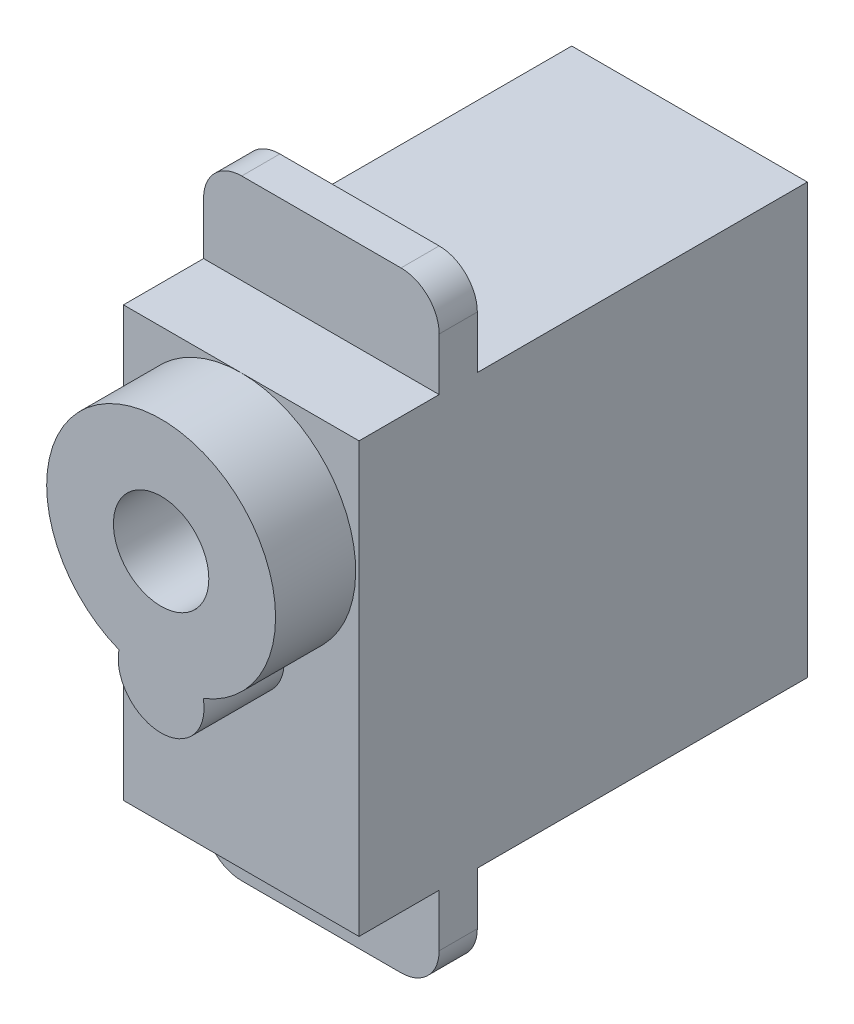
ISO-10303-21;
HEADER;
FILE_DESCRIPTION(('STEP AP214'),'2;1');
FILE_NAME('part.step','',(''),(''),'','','');
FILE_SCHEMA(('AUTOMOTIVE_DESIGN { 1 0 10303 214 1 1 1 1 }'));
ENDSEC;
DATA;
#1=APPLICATION_CONTEXT('core data for automotive mechanical design processes');
#2=APPLICATION_PROTOCOL_DEFINITION('international standard','automotive_design',2000,#1);
#3=PRODUCT_CONTEXT('',#1,'mechanical');
#4=PRODUCT('Part','Part','',(#3));
#5=PRODUCT_RELATED_PRODUCT_CATEGORY('part','',(#4));
#6=PRODUCT_DEFINITION_FORMATION('','',#4);
#7=PRODUCT_DEFINITION_CONTEXT('part definition',#1,'design');
#8=PRODUCT_DEFINITION('design','',#6,#7);
#9=PRODUCT_DEFINITION_SHAPE('','',#8);
#10=(LENGTH_UNIT() NAMED_UNIT(*) SI_UNIT(.MILLI.,.METRE.));
#11=(NAMED_UNIT(*) PLANE_ANGLE_UNIT() SI_UNIT($,.RADIAN.));
#12=(NAMED_UNIT(*) SI_UNIT($,.STERADIAN.) SOLID_ANGLE_UNIT());
#13=UNCERTAINTY_MEASURE_WITH_UNIT(LENGTH_MEASURE(1.E-05),#10,'distance_accuracy_value','');
#14=(GEOMETRIC_REPRESENTATION_CONTEXT(3) GLOBAL_UNCERTAINTY_ASSIGNED_CONTEXT((#13)) GLOBAL_UNIT_ASSIGNED_CONTEXT((#10,
#11,#12)) REPRESENTATION_CONTEXT('',''));
#15=CARTESIAN_POINT('',(0.,0.,0.));
#16=DIRECTION('',(0.,0.,1.));
#17=DIRECTION('',(1.,0.,0.));
#18=AXIS2_PLACEMENT_3D('',#15,#16,#17);
#19=CARTESIAN_POINT('',(6.175,7.58418091123829,178.866706922271));
#20=DIRECTION('',(0.,-1.,0.));
#21=DIRECTION('',(0.,0.,-1.));
#22=AXIS2_PLACEMENT_3D('',#19,#20,#21);
#23=PLANE('',#22);
#24=DIRECTION('',(-1.,0.,0.));
#25=VECTOR('',#24,1.);
#26=CARTESIAN_POINT('',(6.175,7.58418091123829,172.666706922271));
#27=LINE('',#26,#25);
#28=CARTESIAN_POINT('',(6.175,7.5841809112383,172.666706922271));
#29=VERTEX_POINT('',#28);
#30=CARTESIAN_POINT('',(-6.175,7.5841809112383,172.666706922271));
#31=VERTEX_POINT('',#30);
#32=EDGE_CURVE('E228',#29,#31,#27,.T.);
#33=ORIENTED_EDGE('',*,*,#32,.F.);
#34=DIRECTION('',(0.,0.,1.));
#35=VECTOR('',#34,1.);
#36=CARTESIAN_POINT('',(6.175,7.58418091123829,178.866706922271));
#37=LINE('',#36,#35);
#38=CARTESIAN_POINT('',(6.175,7.5841809112383,155.366706922271));
#39=VERTEX_POINT('',#38);
#40=EDGE_CURVE('E232',#39,#29,#37,.T.);
#41=ORIENTED_EDGE('',*,*,#40,.F.);
#42=DIRECTION('',(-1.,0.,0.));
#43=VECTOR('',#42,1.);
#44=CARTESIAN_POINT('',(6.175,7.5841809112383,155.366706922271));
#45=LINE('',#44,#43);
#46=CARTESIAN_POINT('',(-6.175,7.5841809112383,155.366706922271));
#47=VERTEX_POINT('',#46);
#48=EDGE_CURVE('E245',#39,#47,#45,.T.);
#49=ORIENTED_EDGE('',*,*,#48,.T.);
#50=DIRECTION('',(0.,0.,1.));
#51=VECTOR('',#50,1.);
#52=CARTESIAN_POINT('',(-6.175,7.58418091123829,178.866706922271));
#53=LINE('',#52,#51);
#54=EDGE_CURVE('E246',#47,#31,#53,.T.);
#55=ORIENTED_EDGE('',*,*,#54,.T.);
#56=EDGE_LOOP('',(#33,#41,#49,#55));
#57=FACE_BOUND('',#56,.T.);
#58=ADVANCED_FACE('F38',(#57),#23,.F.);
#59=CARTESIAN_POINT('',(6.175,-14.9158190887617,178.866706922271));
#60=DIRECTION('',(0.,1.,0.));
#61=DIRECTION('',(0.,0.,1.));
#62=AXIS2_PLACEMENT_3D('',#59,#60,#61);
#63=PLANE('',#62);
#64=DIRECTION('',(1.,0.,0.));
#65=VECTOR('',#64,1.);
#66=CARTESIAN_POINT('',(6.175,-14.9158190887617,172.666706922271));
#67=LINE('',#66,#65);
#68=CARTESIAN_POINT('',(-6.175,-14.9158190887617,172.666706922271));
#69=VERTEX_POINT('',#68);
#70=CARTESIAN_POINT('',(6.175,-14.9158190887617,172.666706922271));
#71=VERTEX_POINT('',#70);
#72=EDGE_CURVE('E225',#69,#71,#67,.T.);
#73=ORIENTED_EDGE('',*,*,#72,.F.);
#74=DIRECTION('',(0.,0.,-1.));
#75=VECTOR('',#74,1.);
#76=CARTESIAN_POINT('',(-6.175,-14.9158190887617,178.866706922271));
#77=LINE('',#76,#75);
#78=CARTESIAN_POINT('',(-6.175,-14.9158190887617,155.366706922271));
#79=VERTEX_POINT('',#78);
#80=EDGE_CURVE('E251',#69,#79,#77,.T.);
#81=ORIENTED_EDGE('',*,*,#80,.T.);
#82=DIRECTION('',(-1.,0.,0.));
#83=VECTOR('',#82,1.);
#84=CARTESIAN_POINT('',(6.175,-14.9158190887617,155.366706922271));
#85=LINE('',#84,#83);
#86=CARTESIAN_POINT('',(6.175,-14.9158190887617,155.366706922271));
#87=VERTEX_POINT('',#86);
#88=EDGE_CURVE('E260',#87,#79,#85,.T.);
#89=ORIENTED_EDGE('',*,*,#88,.F.);
#90=DIRECTION('',(0.,0.,-1.));
#91=VECTOR('',#90,1.);
#92=CARTESIAN_POINT('',(6.175,-14.9158190887617,178.866706922271));
#93=LINE('',#92,#91);
#94=EDGE_CURVE('E239',#71,#87,#93,.T.);
#95=ORIENTED_EDGE('',*,*,#94,.F.);
#96=EDGE_LOOP('',(#73,#81,#89,#95));
#97=FACE_BOUND('',#96,.T.);
#98=ADVANCED_FACE('F315',(#97),#63,.F.);
#99=CARTESIAN_POINT('',(6.175,7.5841809112383,174.666706922271));
#100=VERTEX_POINT('',#99);
#101=CARTESIAN_POINT('',(6.175,7.58418091123829,178.866706922271));
#102=VERTEX_POINT('',#101);
#103=EDGE_CURVE('E236',#100,#102,#37,.T.);
#104=ORIENTED_EDGE('',*,*,#103,.F.);
#105=DIRECTION('',(-1.,0.,0.));
#106=VECTOR('',#105,1.);
#107=CARTESIAN_POINT('',(6.175,7.58418091123829,174.666706922271));
#108=LINE('',#107,#106);
#109=CARTESIAN_POINT('',(-6.175,7.58418091123829,174.666706922271));
#110=VERTEX_POINT('',#109);
#111=EDGE_CURVE('E222',#100,#110,#108,.T.);
#112=ORIENTED_EDGE('',*,*,#111,.T.);
#113=CARTESIAN_POINT('',(-6.175,7.58418091123829,178.866706922271));
#114=VERTEX_POINT('',#113);
#115=EDGE_CURVE('E231',#110,#114,#53,.T.);
#116=ORIENTED_EDGE('',*,*,#115,.T.);
#117=DIRECTION('',(-1.,0.,0.));
#118=VECTOR('',#117,1.);
#119=CARTESIAN_POINT('',(6.175,7.58418091123829,178.866706922271));
#120=LINE('',#119,#118);
#121=CARTESIAN_POINT('',(0.,7.58418091123829,178.866706922271));
#122=VERTEX_POINT('',#121);
#123=EDGE_CURVE('E267',#122,#114,#120,.T.);
#124=ORIENTED_EDGE('',*,*,#123,.F.);
#125=EDGE_CURVE('E268',#102,#122,#120,.T.);
#126=ORIENTED_EDGE('',*,*,#125,.F.);
#127=EDGE_LOOP('',(#104,#112,#116,#124,#126));
#128=FACE_BOUND('',#127,.T.);
#129=ADVANCED_FACE('F332',(#128),#23,.F.);
#130=CARTESIAN_POINT('',(6.175,7.58418091123829,178.866706922271));
#131=DIRECTION('',(0.,0.,-1.));
#132=DIRECTION('',(-1.,0.,0.));
#133=AXIS2_PLACEMENT_3D('',#130,#131,#132);
#134=PLANE('',#133);
#135=CARTESIAN_POINT('',(0.,-4.41581908876171,178.866706922271));
#136=DIRECTION('',(0.,0.,1.));
#137=DIRECTION('',(1.,0.,0.));
#138=AXIS2_PLACEMENT_3D('',#135,#136,#137);
#139=CIRCLE('',#138,2.25);
#140=CARTESIAN_POINT('',(-2.21009535639868,-3.99394408876171,178.866706922271));
#141=VERTEX_POINT('',#140);
#142=CARTESIAN_POINT('',(2.21009535639868,-3.99394408876171,178.866706922271));
#143=VERTEX_POINT('',#142);
#144=EDGE_CURVE('E187',#141,#143,#139,.T.);
#145=ORIENTED_EDGE('',*,*,#144,.F.);
#146=CARTESIAN_POINT('',(0.,1.58418091123829,178.866706922271));
#147=DIRECTION('',(0.,0.,1.));
#148=DIRECTION('',(1.,0.,0.));
#149=AXIS2_PLACEMENT_3D('',#146,#147,#148);
#150=CIRCLE('',#149,6.);
#151=EDGE_CURVE('E271',#122,#141,#150,.T.);
#152=ORIENTED_EDGE('',*,*,#151,.F.);
#153=ORIENTED_EDGE('',*,*,#123,.T.);
#154=DIRECTION('',(0.,-1.,0.));
#155=VECTOR('',#154,1.);
#156=CARTESIAN_POINT('',(-6.175,7.58418091123829,178.866706922271));
#157=LINE('',#156,#155);
#158=CARTESIAN_POINT('',(-6.175,-14.9158190887617,178.866706922271));
#159=VERTEX_POINT('',#158);
#160=EDGE_CURVE('E249',#114,#159,#157,.T.);
#161=ORIENTED_EDGE('',*,*,#160,.T.);
#162=DIRECTION('',(-1.,0.,0.));
#163=VECTOR('',#162,1.);
#164=CARTESIAN_POINT('',(6.175,-14.9158190887617,178.866706922271));
#165=LINE('',#164,#163);
#166=CARTESIAN_POINT('',(6.175,-14.9158190887617,178.866706922271));
#167=VERTEX_POINT('',#166);
#168=EDGE_CURVE('E264',#167,#159,#165,.T.);
#169=ORIENTED_EDGE('',*,*,#168,.F.);
#170=DIRECTION('',(0.,-1.,0.));
#171=VECTOR('',#170,1.);
#172=CARTESIAN_POINT('',(6.175,7.58418091123829,178.866706922271));
#173=LINE('',#172,#171);
#174=EDGE_CURVE('E235',#102,#167,#173,.T.);
#175=ORIENTED_EDGE('',*,*,#174,.F.);
#176=ORIENTED_EDGE('',*,*,#125,.T.);
#177=EDGE_CURVE('E184',#143,#122,#150,.T.);
#178=ORIENTED_EDGE('',*,*,#177,.F.);
#179=EDGE_LOOP('',(#145,#152,#153,#161,#169,#175,#176,#178));
#180=FACE_BOUND('',#179,.T.);
#181=ADVANCED_FACE('F312',(#180),#134,.F.);
#182=CARTESIAN_POINT('',(-6.175,-14.9158190887617,174.666706922271));
#183=VERTEX_POINT('',#182);
#184=EDGE_CURVE('E252',#159,#183,#77,.T.);
#185=ORIENTED_EDGE('',*,*,#184,.T.);
#186=DIRECTION('',(1.,0.,0.));
#187=VECTOR('',#186,1.);
#188=CARTESIAN_POINT('',(6.175,-14.9158190887617,174.666706922271));
#189=LINE('',#188,#187);
#190=CARTESIAN_POINT('',(6.175,-14.9158190887617,174.666706922271));
#191=VERTEX_POINT('',#190);
#192=EDGE_CURVE('E206',#183,#191,#189,.T.);
#193=ORIENTED_EDGE('',*,*,#192,.T.);
#194=EDGE_CURVE('E240',#167,#191,#93,.T.);
#195=ORIENTED_EDGE('',*,*,#194,.F.);
#196=ORIENTED_EDGE('',*,*,#168,.T.);
#197=EDGE_LOOP('',(#185,#193,#195,#196));
#198=FACE_BOUND('',#197,.T.);
#199=ADVANCED_FACE('F307',(#198),#63,.F.);
#200=CARTESIAN_POINT('',(6.175,7.5841809112383,155.366706922271));
#201=DIRECTION('',(0.,0.,1.));
#202=DIRECTION('',(1.,0.,0.));
#203=AXIS2_PLACEMENT_3D('',#200,#201,#202);
#204=PLANE('',#203);
#205=DIRECTION('',(0.,1.,0.));
#206=VECTOR('',#205,1.);
#207=CARTESIAN_POINT('',(-6.175,7.5841809112383,155.366706922271));
#208=LINE('',#207,#206);
#209=EDGE_CURVE('E255',#79,#47,#208,.T.);
#210=ORIENTED_EDGE('',*,*,#209,.T.);
#211=ORIENTED_EDGE('',*,*,#48,.F.);
#212=DIRECTION('',(0.,1.,0.));
#213=VECTOR('',#212,1.);
#214=CARTESIAN_POINT('',(6.175,7.5841809112383,155.366706922271));
#215=LINE('',#214,#213);
#216=EDGE_CURVE('E243',#87,#39,#215,.T.);
#217=ORIENTED_EDGE('',*,*,#216,.F.);
#218=ORIENTED_EDGE('',*,*,#88,.T.);
#219=EDGE_LOOP('',(#210,#211,#217,#218));
#220=FACE_BOUND('',#219,.T.);
#221=ADVANCED_FACE('F311',(#220),#204,.F.);
#222=CARTESIAN_POINT('',(6.175,0.,0.));
#223=DIRECTION('',(-1.,0.,0.));
#224=DIRECTION('',(0.,0.,1.));
#225=AXIS2_PLACEMENT_3D('',#222,#223,#224);
#226=PLANE('',#225);
#227=DIRECTION('',(0.,1.,0.));
#228=VECTOR('',#227,1.);
#229=CARTESIAN_POINT('',(6.175,12.3341809112383,174.666706922271));
#230=LINE('',#229,#228);
#231=CARTESIAN_POINT('',(6.175,-17.6658190887617,174.666706922271));
#232=VERTEX_POINT('',#231);
#233=EDGE_CURVE('E214',#232,#191,#230,.T.);
#234=ORIENTED_EDGE('',*,*,#233,.F.);
#235=DIRECTION('',(0.,0.,1.));
#236=VECTOR('',#235,1.);
#237=CARTESIAN_POINT('',(6.175,-17.6658190887617,172.666706922271));
#238=LINE('',#237,#236);
#239=CARTESIAN_POINT('',(6.175,-17.6658190887617,172.666706922271));
#240=VERTEX_POINT('',#239);
#241=EDGE_CURVE('E284',#232,#240,#238,.F.);
#242=ORIENTED_EDGE('',*,*,#241,.T.);
#243=DIRECTION('',(0.,1.,0.));
#244=VECTOR('',#243,1.);
#245=CARTESIAN_POINT('',(6.175,12.3341809112383,172.666706922271));
#246=LINE('',#245,#244);
#247=EDGE_CURVE('E203',#240,#71,#246,.T.);
#248=ORIENTED_EDGE('',*,*,#247,.T.);
#249=ORIENTED_EDGE('',*,*,#94,.T.);
#250=ORIENTED_EDGE('',*,*,#216,.T.);
#251=ORIENTED_EDGE('',*,*,#40,.T.);
#252=CARTESIAN_POINT('',(6.175,10.3341809112383,172.666706922271));
#253=VERTEX_POINT('',#252);
#254=EDGE_CURVE('E202',#29,#253,#246,.T.);
#255=ORIENTED_EDGE('',*,*,#254,.T.);
#256=DIRECTION('',(0.,0.,1.));
#257=VECTOR('',#256,1.);
#258=CARTESIAN_POINT('',(6.175,10.3341809112383,174.666706922271));
#259=LINE('',#258,#257);
#260=CARTESIAN_POINT('',(6.175,10.3341809112383,174.666706922271));
#261=VERTEX_POINT('',#260);
#262=EDGE_CURVE('E281',#253,#261,#259,.T.);
#263=ORIENTED_EDGE('',*,*,#262,.T.);
#264=EDGE_CURVE('E213',#100,#261,#230,.T.);
#265=ORIENTED_EDGE('',*,*,#264,.F.);
#266=ORIENTED_EDGE('',*,*,#103,.T.);
#267=ORIENTED_EDGE('',*,*,#174,.T.);
#268=ORIENTED_EDGE('',*,*,#194,.T.);
#269=EDGE_LOOP('',(#234,#242,#248,#249,#250,#251,#255,#263,#265,#266,#267,#268));
#270=FACE_BOUND('',#269,.T.);
#271=ADVANCED_FACE('F349',(#270),#226,.F.);
#272=CARTESIAN_POINT('',(-6.175,0.,0.));
#273=DIRECTION('',(-1.,0.,0.));
#274=DIRECTION('',(0.,0.,1.));
#275=AXIS2_PLACEMENT_3D('',#272,#273,#274);
#276=PLANE('',#275);
#277=DIRECTION('',(0.,-1.,0.));
#278=VECTOR('',#277,1.);
#279=CARTESIAN_POINT('',(-6.175,12.3341809112383,172.666706922271));
#280=LINE('',#279,#278);
#281=CARTESIAN_POINT('',(-6.175,-17.6658190887617,172.666706922271));
#282=VERTEX_POINT('',#281);
#283=EDGE_CURVE('E199',#69,#282,#280,.T.);
#284=ORIENTED_EDGE('',*,*,#283,.T.);
#285=DIRECTION('',(0.,0.,1.));
#286=VECTOR('',#285,1.);
#287=CARTESIAN_POINT('',(-6.175,-17.6658190887617,0.));
#288=LINE('',#287,#286);
#289=CARTESIAN_POINT('',(-6.175,-17.6658190887617,174.666706922271));
#290=VERTEX_POINT('',#289);
#291=EDGE_CURVE('E292',#282,#290,#288,.T.);
#292=ORIENTED_EDGE('',*,*,#291,.T.);
#293=DIRECTION('',(0.,-1.,0.));
#294=VECTOR('',#293,1.);
#295=CARTESIAN_POINT('',(-6.175,12.3341809112383,174.666706922271));
#296=LINE('',#295,#294);
#297=EDGE_CURVE('E188',#183,#290,#296,.T.);
#298=ORIENTED_EDGE('',*,*,#297,.F.);
#299=ORIENTED_EDGE('',*,*,#184,.F.);
#300=ORIENTED_EDGE('',*,*,#160,.F.);
#301=ORIENTED_EDGE('',*,*,#115,.F.);
#302=CARTESIAN_POINT('',(-6.175,10.3341809112383,174.666706922271));
#303=VERTEX_POINT('',#302);
#304=EDGE_CURVE('E191',#303,#110,#296,.T.);
#305=ORIENTED_EDGE('',*,*,#304,.F.);
#306=DIRECTION('',(0.,0.,1.));
#307=VECTOR('',#306,1.);
#308=CARTESIAN_POINT('',(-6.175,10.3341809112383,0.));
#309=LINE('',#308,#307);
#310=CARTESIAN_POINT('',(-6.175,10.3341809112383,172.666706922271));
#311=VERTEX_POINT('',#310);
#312=EDGE_CURVE('E290',#303,#311,#309,.F.);
#313=ORIENTED_EDGE('',*,*,#312,.T.);
#314=EDGE_CURVE('E196',#311,#31,#280,.T.);
#315=ORIENTED_EDGE('',*,*,#314,.T.);
#316=ORIENTED_EDGE('',*,*,#54,.F.);
#317=ORIENTED_EDGE('',*,*,#209,.F.);
#318=ORIENTED_EDGE('',*,*,#80,.F.);
#319=EDGE_LOOP('',(#284,#292,#298,#299,#300,#301,#305,#313,#315,#316,#317,#318));
#320=FACE_BOUND('',#319,.T.);
#321=ADVANCED_FACE('F353',(#320),#276,.T.);
#322=CARTESIAN_POINT('',(-6.175,-19.6658190887617,172.666706922271));
#323=DIRECTION('',(0.,-1.,0.));
#324=DIRECTION('',(1.,0.,0.));
#325=AXIS2_PLACEMENT_3D('',#322,#323,#324);
#326=PLANE('',#325);
#327=DIRECTION('',(1.,0.,0.));
#328=VECTOR('',#327,1.);
#329=CARTESIAN_POINT('',(-6.175,-19.6658190887617,172.666706922271));
#330=LINE('',#329,#328);
#331=CARTESIAN_POINT('',(-4.175,-19.6658190887617,172.666706922271));
#332=VERTEX_POINT('',#331);
#333=CARTESIAN_POINT('',(4.175,-19.6658190887617,172.666706922271));
#334=VERTEX_POINT('',#333);
#335=EDGE_CURVE('E198',#332,#334,#330,.T.);
#336=ORIENTED_EDGE('',*,*,#335,.T.);
#337=DIRECTION('',(0.,0.,1.));
#338=VECTOR('',#337,1.);
#339=CARTESIAN_POINT('',(4.175,-19.6658190887617,174.666706922271));
#340=LINE('',#339,#338);
#341=CARTESIAN_POINT('',(4.175,-19.6658190887617,174.666706922271));
#342=VERTEX_POINT('',#341);
#343=EDGE_CURVE('E274',#334,#342,#340,.T.);
#344=ORIENTED_EDGE('',*,*,#343,.T.);
#345=DIRECTION('',(1.,0.,0.));
#346=VECTOR('',#345,1.);
#347=CARTESIAN_POINT('',(-6.175,-19.6658190887617,174.666706922271));
#348=LINE('',#347,#346);
#349=CARTESIAN_POINT('',(-4.175,-19.6658190887617,174.666706922271));
#350=VERTEX_POINT('',#349);
#351=EDGE_CURVE('E209',#350,#342,#348,.T.);
#352=ORIENTED_EDGE('',*,*,#351,.F.);
#353=DIRECTION('',(0.,0.,1.));
#354=VECTOR('',#353,1.);
#355=CARTESIAN_POINT('',(-4.175,-19.6658190887617,172.666706922271));
#356=LINE('',#355,#354);
#357=EDGE_CURVE('E272',#350,#332,#356,.F.);
#358=ORIENTED_EDGE('',*,*,#357,.T.);
#359=EDGE_LOOP('',(#336,#344,#352,#358));
#360=FACE_BOUND('',#359,.T.);
#361=ADVANCED_FACE('F373',(#360),#326,.T.);
#362=CARTESIAN_POINT('',(0.,0.,172.666706922271));
#363=DIRECTION('',(0.,0.,1.));
#364=DIRECTION('',(1.,0.,0.));
#365=AXIS2_PLACEMENT_3D('',#362,#363,#364);
#366=PLANE('',#365);
#367=ORIENTED_EDGE('',*,*,#247,.F.);
#368=CARTESIAN_POINT('',(4.175,-17.6658190887617,172.666706922271));
#369=DIRECTION('',(0.,0.,1.));
#370=DIRECTION('',(1.,0.,0.));
#371=AXIS2_PLACEMENT_3D('',#368,#369,#370);
#372=CIRCLE('',#371,2.);
#373=EDGE_CURVE('E288',#240,#334,#372,.F.);
#374=ORIENTED_EDGE('',*,*,#373,.T.);
#375=ORIENTED_EDGE('',*,*,#335,.F.);
#376=CARTESIAN_POINT('',(-4.175,-17.6658190887617,172.666706922271));
#377=DIRECTION('',(0.,0.,1.));
#378=DIRECTION('',(1.,0.,0.));
#379=AXIS2_PLACEMENT_3D('',#376,#377,#378);
#380=CIRCLE('',#379,2.);
#381=EDGE_CURVE('E286',#332,#282,#380,.F.);
#382=ORIENTED_EDGE('',*,*,#381,.T.);
#383=ORIENTED_EDGE('',*,*,#283,.F.);
#384=ORIENTED_EDGE('',*,*,#72,.T.);
#385=EDGE_LOOP('',(#367,#374,#375,#382,#383,#384));
#386=FACE_BOUND('',#385,.T.);
#387=ADVANCED_FACE('F367',(#386),#366,.F.);
#388=CARTESIAN_POINT('',(0.,0.,174.666706922271));
#389=DIRECTION('',(0.,0.,1.));
#390=DIRECTION('',(1.,0.,0.));
#391=AXIS2_PLACEMENT_3D('',#388,#389,#390);
#392=PLANE('',#391);
#393=ORIENTED_EDGE('',*,*,#351,.T.);
#394=CARTESIAN_POINT('',(4.175,-17.6658190887617,174.666706922271));
#395=DIRECTION('',(0.,0.,1.));
#396=DIRECTION('',(1.,0.,0.));
#397=AXIS2_PLACEMENT_3D('',#394,#395,#396);
#398=CIRCLE('',#397,2.);
#399=EDGE_CURVE('E279',#342,#232,#398,.T.);
#400=ORIENTED_EDGE('',*,*,#399,.T.);
#401=ORIENTED_EDGE('',*,*,#233,.T.);
#402=ORIENTED_EDGE('',*,*,#192,.F.);
#403=ORIENTED_EDGE('',*,*,#297,.T.);
#404=CARTESIAN_POINT('',(-4.175,-17.6658190887617,174.666706922271));
#405=DIRECTION('',(0.,0.,1.));
#406=DIRECTION('',(1.,0.,0.));
#407=AXIS2_PLACEMENT_3D('',#404,#405,#406);
#408=CIRCLE('',#407,2.);
#409=EDGE_CURVE('E277',#290,#350,#408,.T.);
#410=ORIENTED_EDGE('',*,*,#409,.T.);
#411=EDGE_LOOP('',(#393,#400,#401,#402,#403,#410));
#412=FACE_BOUND('',#411,.T.);
#413=ADVANCED_FACE('F372',(#412),#392,.T.);
#414=DIRECTION('',(-1.,0.,0.));
#415=VECTOR('',#414,1.);
#416=CARTESIAN_POINT('',(-6.175,12.3341809112383,172.666706922271));
#417=LINE('',#416,#415);
#418=CARTESIAN_POINT('',(4.175,12.3341809112383,172.666706922271));
#419=VERTEX_POINT('',#418);
#420=CARTESIAN_POINT('',(-4.175,12.3341809112383,172.666706922271));
#421=VERTEX_POINT('',#420);
#422=EDGE_CURVE('E205',#419,#421,#417,.T.);
#423=ORIENTED_EDGE('',*,*,#422,.F.);
#424=CARTESIAN_POINT('',(4.175,10.3341809112383,172.666706922271));
#425=DIRECTION('',(0.,0.,1.));
#426=DIRECTION('',(1.,0.,0.));
#427=AXIS2_PLACEMENT_3D('',#424,#425,#426);
#428=CIRCLE('',#427,2.);
#429=EDGE_CURVE('E11',#419,#253,#428,.F.);
#430=ORIENTED_EDGE('',*,*,#429,.T.);
#431=ORIENTED_EDGE('',*,*,#254,.F.);
#432=ORIENTED_EDGE('',*,*,#32,.T.);
#433=ORIENTED_EDGE('',*,*,#314,.F.);
#434=CARTESIAN_POINT('',(-4.175,10.3341809112383,172.666706922271));
#435=DIRECTION('',(0.,0.,1.));
#436=DIRECTION('',(1.,0.,0.));
#437=AXIS2_PLACEMENT_3D('',#434,#435,#436);
#438=CIRCLE('',#437,2.);
#439=EDGE_CURVE('E46',#311,#421,#438,.F.);
#440=ORIENTED_EDGE('',*,*,#439,.T.);
#441=EDGE_LOOP('',(#423,#430,#431,#432,#433,#440));
#442=FACE_BOUND('',#441,.T.);
#443=ADVANCED_FACE('F376',(#442),#366,.F.);
#444=ORIENTED_EDGE('',*,*,#264,.T.);
#445=CARTESIAN_POINT('',(4.175,10.3341809112383,174.666706922271));
#446=DIRECTION('',(0.,0.,1.));
#447=DIRECTION('',(1.,0.,0.));
#448=AXIS2_PLACEMENT_3D('',#445,#446,#447);
#449=CIRCLE('',#448,2.);
#450=CARTESIAN_POINT('',(4.175,12.3341809112383,174.666706922271));
#451=VERTEX_POINT('',#450);
#452=EDGE_CURVE('E297',#261,#451,#449,.T.);
#453=ORIENTED_EDGE('',*,*,#452,.T.);
#454=DIRECTION('',(-1.,0.,0.));
#455=VECTOR('',#454,1.);
#456=CARTESIAN_POINT('',(-6.175,12.3341809112383,174.666706922271));
#457=LINE('',#456,#455);
#458=CARTESIAN_POINT('',(-4.175,12.3341809112383,174.666706922271));
#459=VERTEX_POINT('',#458);
#460=EDGE_CURVE('E216',#451,#459,#457,.T.);
#461=ORIENTED_EDGE('',*,*,#460,.T.);
#462=CARTESIAN_POINT('',(-4.175,10.3341809112383,174.666706922271));
#463=DIRECTION('',(0.,0.,1.));
#464=DIRECTION('',(1.,0.,0.));
#465=AXIS2_PLACEMENT_3D('',#462,#463,#464);
#466=CIRCLE('',#465,2.);
#467=EDGE_CURVE('E295',#459,#303,#466,.T.);
#468=ORIENTED_EDGE('',*,*,#467,.T.);
#469=ORIENTED_EDGE('',*,*,#304,.T.);
#470=ORIENTED_EDGE('',*,*,#111,.F.);
#471=EDGE_LOOP('',(#444,#453,#461,#468,#469,#470));
#472=FACE_BOUND('',#471,.T.);
#473=ADVANCED_FACE('F384',(#472),#392,.T.);
#474=CARTESIAN_POINT('',(-6.175,12.3341809112383,172.666706922271));
#475=DIRECTION('',(0.,1.,0.));
#476=DIRECTION('',(0.,0.,1.));
#477=AXIS2_PLACEMENT_3D('',#474,#475,#476);
#478=PLANE('',#477);
#479=ORIENTED_EDGE('',*,*,#460,.F.);
#480=DIRECTION('',(0.,0.,1.));
#481=VECTOR('',#480,1.);
#482=CARTESIAN_POINT('',(4.175,12.3341809112383,172.666706922271));
#483=LINE('',#482,#481);
#484=EDGE_CURVE('E59',#451,#419,#483,.F.);
#485=ORIENTED_EDGE('',*,*,#484,.T.);
#486=ORIENTED_EDGE('',*,*,#422,.T.);
#487=DIRECTION('',(0.,0.,1.));
#488=VECTOR('',#487,1.);
#489=CARTESIAN_POINT('',(-4.175,12.3341809112383,172.666706922271));
#490=LINE('',#489,#488);
#491=EDGE_CURVE('E300',#421,#459,#490,.T.);
#492=ORIENTED_EDGE('',*,*,#491,.T.);
#493=EDGE_LOOP('',(#479,#485,#486,#492));
#494=FACE_BOUND('',#493,.T.);
#495=ADVANCED_FACE('F389',(#494),#478,.T.);
#496=CARTESIAN_POINT('',(0.,-4.41581908876171,183.066706922271));
#497=DIRECTION('',(0.,0.,-1.));
#498=DIRECTION('',(-1.,0.,0.));
#499=AXIS2_PLACEMENT_3D('',#496,#497,#498);
#500=CYLINDRICAL_SURFACE('',#499,2.25);
#501=ORIENTED_EDGE('',*,*,#144,.T.);
#502=DIRECTION('',(0.,0.,-1.));
#503=VECTOR('',#502,1.);
#504=CARTESIAN_POINT('',(2.21009535639868,-3.99394408876171,183.066706922271));
#505=LINE('',#504,#503);
#506=CARTESIAN_POINT('',(2.21009535639868,-3.99394408876171,183.066706922271));
#507=VERTEX_POINT('',#506);
#508=EDGE_CURVE('E171',#507,#143,#505,.T.);
#509=ORIENTED_EDGE('',*,*,#508,.F.);
#510=CARTESIAN_POINT('',(0.,-4.41581908876171,183.066706922271));
#511=DIRECTION('',(0.,0.,1.));
#512=DIRECTION('',(1.,0.,0.));
#513=AXIS2_PLACEMENT_3D('',#510,#511,#512);
#514=CIRCLE('',#513,2.25);
#515=CARTESIAN_POINT('',(-2.21009535639868,-3.99394408876171,183.066706922271));
#516=VERTEX_POINT('',#515);
#517=EDGE_CURVE('E179',#516,#507,#514,.T.);
#518=ORIENTED_EDGE('',*,*,#517,.F.);
#519=DIRECTION('',(0.,0.,-1.));
#520=VECTOR('',#519,1.);
#521=CARTESIAN_POINT('',(-2.21009535639868,-3.99394408876171,183.066706922271));
#522=LINE('',#521,#520);
#523=EDGE_CURVE('E175',#516,#141,#522,.T.);
#524=ORIENTED_EDGE('',*,*,#523,.T.);
#525=EDGE_LOOP('',(#501,#509,#518,#524));
#526=FACE_BOUND('',#525,.T.);
#527=ADVANCED_FACE('F186',(#526),#500,.T.);
#528=CARTESIAN_POINT('',(0.,1.58418091123829,183.066706922271));
#529=DIRECTION('',(0.,0.,-1.));
#530=DIRECTION('',(-1.,0.,0.));
#531=AXIS2_PLACEMENT_3D('',#528,#529,#530);
#532=CYLINDRICAL_SURFACE('',#531,6.);
#533=ORIENTED_EDGE('',*,*,#177,.T.);
#534=ORIENTED_EDGE('',*,*,#151,.T.);
#535=ORIENTED_EDGE('',*,*,#523,.F.);
#536=CARTESIAN_POINT('',(0.,1.58418091123829,183.066706922271));
#537=DIRECTION('',(0.,0.,1.));
#538=DIRECTION('',(1.,0.,0.));
#539=AXIS2_PLACEMENT_3D('',#536,#537,#538);
#540=CIRCLE('',#539,6.);
#541=EDGE_CURVE('E166',#507,#516,#540,.T.);
#542=ORIENTED_EDGE('',*,*,#541,.F.);
#543=ORIENTED_EDGE('',*,*,#508,.T.);
#544=EDGE_LOOP('',(#533,#534,#535,#542,#543));
#545=FACE_BOUND('',#544,.T.);
#546=ADVANCED_FACE('F169',(#545),#532,.T.);
#547=CARTESIAN_POINT('',(0.,-1.41581908876171,183.066706922271));
#548=DIRECTION('',(0.,0.,1.));
#549=DIRECTION('',(1.,0.,0.));
#550=AXIS2_PLACEMENT_3D('',#547,#548,#549);
#551=PLANE('',#550);
#552=CARTESIAN_POINT('',(0.,1.58418091123829,183.066706922271));
#553=DIRECTION('',(0.,0.,1.));
#554=DIRECTION('',(1.,0.,0.));
#555=AXIS2_PLACEMENT_3D('',#552,#553,#554);
#556=CIRCLE('',#555,2.5);
#557=CARTESIAN_POINT('',(2.5,1.58418091123829,183.066706922271));
#558=VERTEX_POINT('',#557);
#559=EDGE_CURVE('E414',#558,#558,#556,.T.);
#560=ORIENTED_EDGE('',*,*,#559,.F.);
#561=EDGE_LOOP('',(#560));
#562=FACE_BOUND('',#561,.T.);
#563=ORIENTED_EDGE('',*,*,#517,.T.);
#564=ORIENTED_EDGE('',*,*,#541,.T.);
#565=EDGE_LOOP('',(#563,#564));
#566=FACE_BOUND('',#565,.T.);
#567=ADVANCED_FACE('F181',(#562,#566),#551,.T.);
#568=CARTESIAN_POINT('',(0.,1.58418091123829,178.866706922271));
#569=DIRECTION('',(0.,0.,1.));
#570=DIRECTION('',(1.,0.,0.));
#571=AXIS2_PLACEMENT_3D('',#568,#569,#570);
#572=CYLINDRICAL_SURFACE('',#571,2.5);
#573=CARTESIAN_POINT('',(0.,1.58418091123829,178.866706922271));
#574=DIRECTION('',(0.,0.,1.));
#575=DIRECTION('',(1.,0.,0.));
#576=AXIS2_PLACEMENT_3D('',#573,#574,#575);
#577=CIRCLE('',#576,2.5);
#578=CARTESIAN_POINT('',(2.5,1.58418091123829,178.866706922271));
#579=VERTEX_POINT('',#578);
#580=EDGE_CURVE('E417',#579,#579,#577,.T.);
#581=ORIENTED_EDGE('',*,*,#580,.F.);
#582=EDGE_LOOP('',(#581));
#583=FACE_BOUND('',#582,.T.);
#584=ORIENTED_EDGE('',*,*,#559,.T.);
#585=EDGE_LOOP('',(#584));
#586=FACE_BOUND('',#585,.T.);
#587=ADVANCED_FACE('F402',(#583,#586),#572,.F.);
#588=CARTESIAN_POINT('',(0.,1.58418091123829,178.866706922271));
#589=DIRECTION('',(0.,0.,1.));
#590=DIRECTION('',(1.,0.,0.));
#591=AXIS2_PLACEMENT_3D('',#588,#589,#590);
#592=PLANE('',#591);
#593=ORIENTED_EDGE('',*,*,#580,.T.);
#594=EDGE_LOOP('',(#593));
#595=FACE_BOUND('',#594,.T.);
#596=ADVANCED_FACE('F440',(#595),#592,.T.);
#597=CARTESIAN_POINT('',(4.175,-17.6658190887617,172.666706922271));
#598=DIRECTION('',(0.,0.,-1.));
#599=DIRECTION('',(-1.,0.,0.));
#600=AXIS2_PLACEMENT_3D('',#597,#598,#599);
#601=CYLINDRICAL_SURFACE('',#600,2.);
#602=ORIENTED_EDGE('',*,*,#373,.F.);
#603=ORIENTED_EDGE('',*,*,#241,.F.);
#604=ORIENTED_EDGE('',*,*,#399,.F.);
#605=ORIENTED_EDGE('',*,*,#343,.F.);
#606=EDGE_LOOP('',(#602,#603,#604,#605));
#607=FACE_BOUND('',#606,.T.);
#608=ADVANCED_FACE('F447',(#607),#601,.T.);
#609=CARTESIAN_POINT('',(-4.175,-17.6658190887617,0.));
#610=DIRECTION('',(0.,0.,1.));
#611=DIRECTION('',(1.,0.,0.));
#612=AXIS2_PLACEMENT_3D('',#609,#610,#611);
#613=CYLINDRICAL_SURFACE('',#612,2.);
#614=ORIENTED_EDGE('',*,*,#381,.F.);
#615=ORIENTED_EDGE('',*,*,#357,.F.);
#616=ORIENTED_EDGE('',*,*,#409,.F.);
#617=ORIENTED_EDGE('',*,*,#291,.F.);
#618=EDGE_LOOP('',(#614,#615,#616,#617));
#619=FACE_BOUND('',#618,.T.);
#620=ADVANCED_FACE('F551',(#619),#613,.T.);
#621=CARTESIAN_POINT('',(4.175,10.3341809112383,0.));
#622=DIRECTION('',(0.,0.,-1.));
#623=DIRECTION('',(-1.,0.,0.));
#624=AXIS2_PLACEMENT_3D('',#621,#622,#623);
#625=CYLINDRICAL_SURFACE('',#624,2.);
#626=ORIENTED_EDGE('',*,*,#429,.F.);
#627=ORIENTED_EDGE('',*,*,#484,.F.);
#628=ORIENTED_EDGE('',*,*,#452,.F.);
#629=ORIENTED_EDGE('',*,*,#262,.F.);
#630=EDGE_LOOP('',(#626,#627,#628,#629));
#631=FACE_BOUND('',#630,.T.);
#632=ADVANCED_FACE('F559',(#631),#625,.T.);
#633=CARTESIAN_POINT('',(-4.175,10.3341809112383,172.666706922271));
#634=DIRECTION('',(0.,0.,1.));
#635=DIRECTION('',(1.,0.,0.));
#636=AXIS2_PLACEMENT_3D('',#633,#634,#635);
#637=CYLINDRICAL_SURFACE('',#636,2.);
#638=ORIENTED_EDGE('',*,*,#439,.F.);
#639=ORIENTED_EDGE('',*,*,#312,.F.);
#640=ORIENTED_EDGE('',*,*,#467,.F.);
#641=ORIENTED_EDGE('',*,*,#491,.F.);
#642=EDGE_LOOP('',(#638,#639,#640,#641));
#643=FACE_BOUND('',#642,.T.);
#644=ADVANCED_FACE('F40',(#643),#637,.T.);
#645=CLOSED_SHELL('',(#58,#98,#129,#181,#199,#221,#271,#321,#361,#387,#413,#443,#473,#495,#527,
#546,#567,#587,#596,#608,#620,#632,#644));
#646=MANIFOLD_SOLID_BREP('B2',#645);
#647=ADVANCED_BREP_SHAPE_REPRESENTATION('',(#18,#646),#14);
#648=SHAPE_DEFINITION_REPRESENTATION(#9,#647);
ENDSEC;
END-ISO-10303-21;
